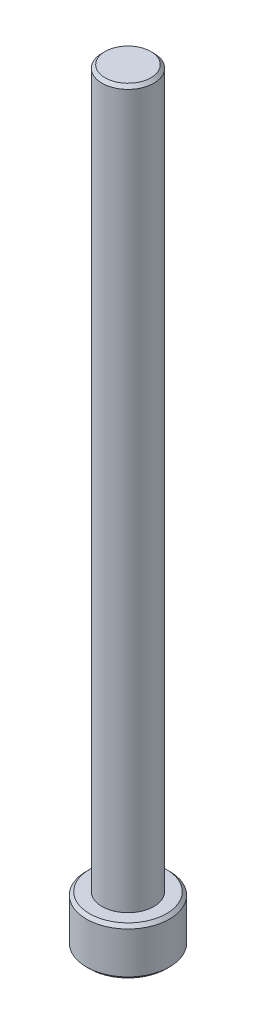
ISO-10303-21;
HEADER;
FILE_DESCRIPTION(('STEP AP214'),'2;1');
FILE_NAME('part.step','',(''),(''),'','','');
FILE_SCHEMA(('AUTOMOTIVE_DESIGN { 1 0 10303 214 1 1 1 1 }'));
ENDSEC;
DATA;
#1=APPLICATION_CONTEXT('core data for automotive mechanical design processes');
#2=APPLICATION_PROTOCOL_DEFINITION('international standard','automotive_design',2000,#1);
#3=PRODUCT_CONTEXT('',#1,'mechanical');
#4=PRODUCT('Part','Part','',(#3));
#5=PRODUCT_RELATED_PRODUCT_CATEGORY('part','',(#4));
#6=PRODUCT_DEFINITION_FORMATION('','',#4);
#7=PRODUCT_DEFINITION_CONTEXT('part definition',#1,'design');
#8=PRODUCT_DEFINITION('design','',#6,#7);
#9=PRODUCT_DEFINITION_SHAPE('','',#8);
#10=(LENGTH_UNIT() NAMED_UNIT(*) SI_UNIT(.MILLI.,.METRE.));
#11=(NAMED_UNIT(*) PLANE_ANGLE_UNIT() SI_UNIT($,.RADIAN.));
#12=(NAMED_UNIT(*) SI_UNIT($,.STERADIAN.) SOLID_ANGLE_UNIT());
#13=UNCERTAINTY_MEASURE_WITH_UNIT(LENGTH_MEASURE(1.E-05),#10,'distance_accuracy_value','');
#14=(GEOMETRIC_REPRESENTATION_CONTEXT(3) GLOBAL_UNCERTAINTY_ASSIGNED_CONTEXT((#13)) GLOBAL_UNIT_ASSIGNED_CONTEXT((#10,
#11,#12)) REPRESENTATION_CONTEXT('',''));
#15=CARTESIAN_POINT('',(0.,0.,0.));
#16=DIRECTION('',(0.,0.,1.));
#17=DIRECTION('',(1.,0.,0.));
#18=AXIS2_PLACEMENT_3D('',#15,#16,#17);
#19=CARTESIAN_POINT('',(0.,4.6,0.));
#20=DIRECTION('',(0.,-1.,0.));
#21=DIRECTION('',(0.,0.,-1.));
#22=AXIS2_PLACEMENT_3D('',#19,#20,#21);
#23=CYLINDRICAL_SURFACE('',#22,4.);
#24=CARTESIAN_POINT('',(0.,0.300000000000012,0.));
#25=DIRECTION('',(0.,1.,0.));
#26=DIRECTION('',(0.,0.,1.));
#27=AXIS2_PLACEMENT_3D('',#24,#25,#26);
#28=CIRCLE('',#27,4.);
#29=CARTESIAN_POINT('',(0.,0.300000000000012,4.));
#30=VERTEX_POINT('',#29);
#31=EDGE_CURVE('E68',#30,#30,#28,.T.);
#32=ORIENTED_EDGE('',*,*,#31,.T.);
#33=EDGE_LOOP('',(#32));
#34=FACE_BOUND('',#33,.T.);
#35=CARTESIAN_POINT('',(0.,4.30000000000001,0.));
#36=DIRECTION('',(0.,1.,0.));
#37=DIRECTION('',(0.,0.,1.));
#38=AXIS2_PLACEMENT_3D('',#35,#36,#37);
#39=CIRCLE('',#38,4.);
#40=CARTESIAN_POINT('',(0.,4.30000000000001,4.));
#41=VERTEX_POINT('',#40);
#42=EDGE_CURVE('E72',#41,#41,#39,.F.);
#43=ORIENTED_EDGE('',*,*,#42,.T.);
#44=EDGE_LOOP('',(#43));
#45=FACE_BOUND('',#44,.T.);
#46=ADVANCED_FACE('F43',(#34,#45),#23,.T.);
#47=CARTESIAN_POINT('',(0.,4.6,0.));
#48=DIRECTION('',(0.,1.,0.));
#49=DIRECTION('',(0.,0.,1.));
#50=AXIS2_PLACEMENT_3D('',#47,#48,#49);
#51=PLANE('',#50);
#52=CARTESIAN_POINT('',(0.,4.6,0.));
#53=DIRECTION('',(0.,1.,0.));
#54=DIRECTION('',(0.,0.,1.));
#55=AXIS2_PLACEMENT_3D('',#52,#53,#54);
#56=CIRCLE('',#55,3.70000000000001);
#57=CARTESIAN_POINT('',(0.,4.6,3.70000000000001));
#58=VERTEX_POINT('',#57);
#59=EDGE_CURVE('E57',#58,#58,#56,.T.);
#60=ORIENTED_EDGE('',*,*,#59,.T.);
#61=EDGE_LOOP('',(#60));
#62=FACE_BOUND('',#61,.T.);
#63=CARTESIAN_POINT('',(0.,4.6,0.));
#64=DIRECTION('',(0.,1.,0.));
#65=DIRECTION('',(0.,0.,1.));
#66=AXIS2_PLACEMENT_3D('',#63,#64,#65);
#67=CIRCLE('',#66,2.5);
#68=CARTESIAN_POINT('',(0.,4.6,2.5));
#69=VERTEX_POINT('',#68);
#70=EDGE_CURVE('E76',#69,#69,#67,.T.);
#71=ORIENTED_EDGE('',*,*,#70,.F.);
#72=EDGE_LOOP('',(#71));
#73=FACE_BOUND('',#72,.T.);
#74=ADVANCED_FACE('F83',(#62,#73),#51,.T.);
#75=CARTESIAN_POINT('',(0.,0.,0.));
#76=DIRECTION('',(0.,1.,0.));
#77=DIRECTION('',(0.,0.,1.));
#78=AXIS2_PLACEMENT_3D('',#75,#76,#77);
#79=PLANE('',#78);
#80=CARTESIAN_POINT('',(0.,0.,0.));
#81=DIRECTION('',(0.,1.,0.));
#82=DIRECTION('',(0.,0.,1.));
#83=AXIS2_PLACEMENT_3D('',#80,#81,#82);
#84=CIRCLE('',#83,3.69999999999999);
#85=CARTESIAN_POINT('',(0.,0.,3.69999999999999));
#86=VERTEX_POINT('',#85);
#87=EDGE_CURVE('E62',#86,#86,#84,.F.);
#88=ORIENTED_EDGE('',*,*,#87,.T.);
#89=EDGE_LOOP('',(#88));
#90=FACE_BOUND('',#89,.T.);
#91=ADVANCED_FACE('F85',(#90),#79,.F.);
#92=CARTESIAN_POINT('',(0.,73.6,0.));
#93=DIRECTION('',(0.,-1.,0.));
#94=DIRECTION('',(0.,0.,-1.));
#95=AXIS2_PLACEMENT_3D('',#92,#93,#94);
#96=CYLINDRICAL_SURFACE('',#95,2.5);
#97=CARTESIAN_POINT('',(0.,73.3,0.));
#98=DIRECTION('',(0.,1.,0.));
#99=DIRECTION('',(0.,0.,1.));
#100=AXIS2_PLACEMENT_3D('',#97,#98,#99);
#101=CIRCLE('',#100,2.5);
#102=CARTESIAN_POINT('',(0.,73.3,2.5));
#103=VERTEX_POINT('',#102);
#104=EDGE_CURVE('E10',#103,#103,#101,.F.);
#105=ORIENTED_EDGE('',*,*,#104,.T.);
#106=EDGE_LOOP('',(#105));
#107=FACE_BOUND('',#106,.T.);
#108=ORIENTED_EDGE('',*,*,#70,.T.);
#109=EDGE_LOOP('',(#108));
#110=FACE_BOUND('',#109,.T.);
#111=ADVANCED_FACE('F81',(#107,#110),#96,.T.);
#112=CARTESIAN_POINT('',(0.,73.6,0.));
#113=DIRECTION('',(0.,1.,0.));
#114=DIRECTION('',(0.,0.,1.));
#115=AXIS2_PLACEMENT_3D('',#112,#113,#114);
#116=PLANE('',#115);
#117=CARTESIAN_POINT('',(0.,73.6,0.));
#118=DIRECTION('',(0.,1.,0.));
#119=DIRECTION('',(0.,0.,1.));
#120=AXIS2_PLACEMENT_3D('',#117,#118,#119);
#121=CIRCLE('',#120,2.20000000000001);
#122=CARTESIAN_POINT('',(0.,73.6,2.20000000000001));
#123=VERTEX_POINT('',#122);
#124=EDGE_CURVE('E52',#123,#123,#121,.T.);
#125=ORIENTED_EDGE('',*,*,#124,.T.);
#126=EDGE_LOOP('',(#125));
#127=FACE_BOUND('',#126,.T.);
#128=ADVANCED_FACE('F106',(#127),#116,.T.);
#129=CARTESIAN_POINT('',(0.,0.300000000000012,0.));
#130=DIRECTION('',(0.,1.,0.));
#131=DIRECTION('',(0.,0.,1.));
#132=AXIS2_PLACEMENT_3D('',#129,#130,#131);
#133=CONICAL_SURFACE('',#132,4.,0.785398163397437);
#134=ORIENTED_EDGE('',*,*,#87,.F.);
#135=EDGE_LOOP('',(#134));
#136=FACE_BOUND('',#135,.T.);
#137=ORIENTED_EDGE('',*,*,#31,.F.);
#138=EDGE_LOOP('',(#137));
#139=FACE_BOUND('',#138,.T.);
#140=ADVANCED_FACE('F100',(#136,#139),#133,.T.);
#141=CARTESIAN_POINT('',(0.,4.6,0.));
#142=DIRECTION('',(0.,-1.,0.));
#143=DIRECTION('',(0.,0.,-1.));
#144=AXIS2_PLACEMENT_3D('',#141,#142,#143);
#145=CONICAL_SURFACE('',#144,3.70000000000001,0.785398163397445);
#146=ORIENTED_EDGE('',*,*,#42,.F.);
#147=EDGE_LOOP('',(#146));
#148=FACE_BOUND('',#147,.T.);
#149=ORIENTED_EDGE('',*,*,#59,.F.);
#150=EDGE_LOOP('',(#149));
#151=FACE_BOUND('',#150,.T.);
#152=ADVANCED_FACE('F105',(#148,#151),#145,.T.);
#153=CARTESIAN_POINT('',(0.,73.6,0.));
#154=DIRECTION('',(0.,-1.,0.));
#155=DIRECTION('',(0.,0.,-1.));
#156=AXIS2_PLACEMENT_3D('',#153,#154,#155);
#157=CONICAL_SURFACE('',#156,2.20000000000001,0.785398163397433);
#158=ORIENTED_EDGE('',*,*,#104,.F.);
#159=EDGE_LOOP('',(#158));
#160=FACE_BOUND('',#159,.T.);
#161=ORIENTED_EDGE('',*,*,#124,.F.);
#162=EDGE_LOOP('',(#161));
#163=FACE_BOUND('',#162,.T.);
#164=ADVANCED_FACE('F46',(#160,#163),#157,.T.);
#165=CLOSED_SHELL('',(#46,#74,#91,#111,#128,#140,#152,#164));
#166=MANIFOLD_SOLID_BREP('B2',#165);
#167=ADVANCED_BREP_SHAPE_REPRESENTATION('',(#18,#166),#14);
#168=SHAPE_DEFINITION_REPRESENTATION(#9,#167);
ENDSEC;
END-ISO-10303-21;
